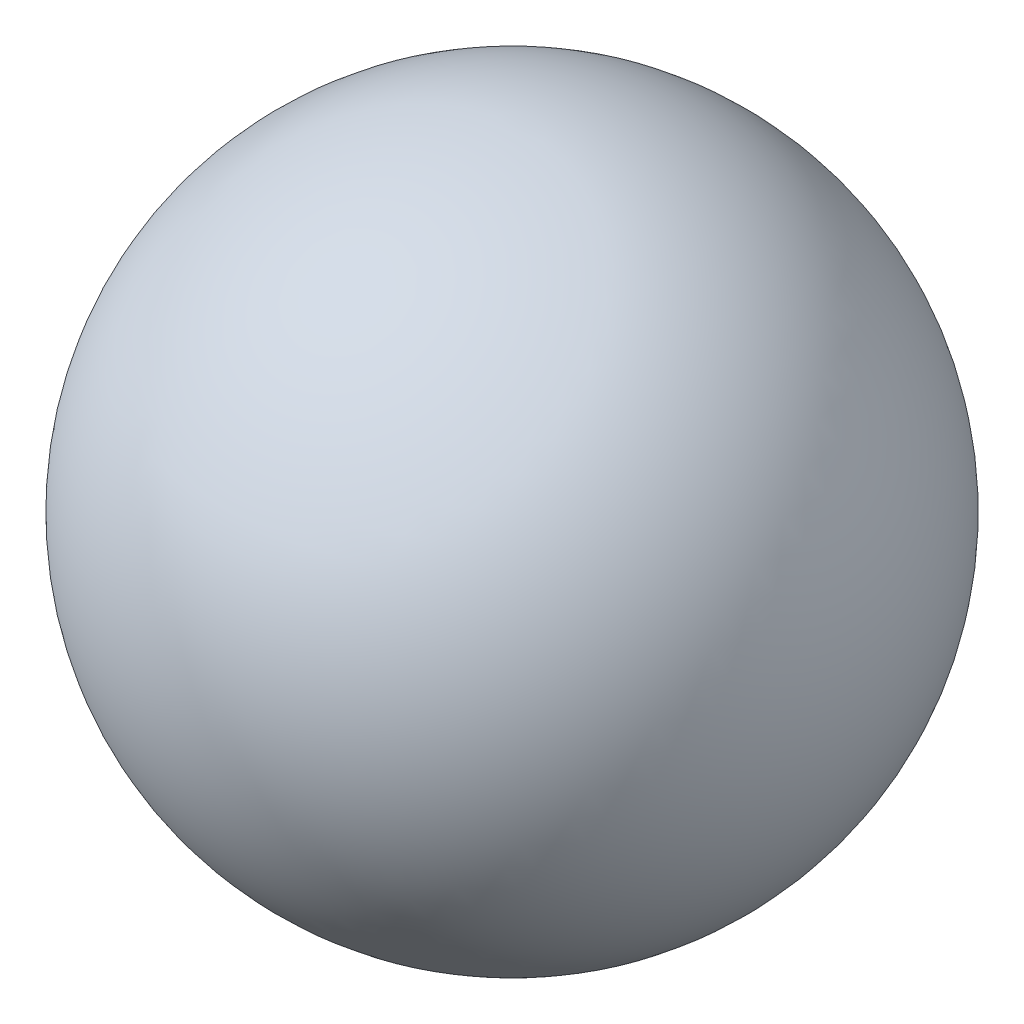
ISO-10303-21;
HEADER;
FILE_DESCRIPTION(('STEP AP214'),'2;1');
FILE_NAME('part.step','',(''),(''),'','','');
FILE_SCHEMA(('AUTOMOTIVE_DESIGN { 1 0 10303 214 1 1 1 1 }'));
ENDSEC;
DATA;
#1=APPLICATION_CONTEXT('core data for automotive mechanical design processes');
#2=APPLICATION_PROTOCOL_DEFINITION('international standard','automotive_design',2000,#1);
#3=PRODUCT_CONTEXT('',#1,'mechanical');
#4=PRODUCT('Part','Part','',(#3));
#5=PRODUCT_RELATED_PRODUCT_CATEGORY('part','',(#4));
#6=PRODUCT_DEFINITION_FORMATION('','',#4);
#7=PRODUCT_DEFINITION_CONTEXT('part definition',#1,'design');
#8=PRODUCT_DEFINITION('design','',#6,#7);
#9=PRODUCT_DEFINITION_SHAPE('','',#8);
#10=(LENGTH_UNIT() NAMED_UNIT(*) SI_UNIT(.MILLI.,.METRE.));
#11=(NAMED_UNIT(*) PLANE_ANGLE_UNIT() SI_UNIT($,.RADIAN.));
#12=(NAMED_UNIT(*) SI_UNIT($,.STERADIAN.) SOLID_ANGLE_UNIT());
#13=UNCERTAINTY_MEASURE_WITH_UNIT(LENGTH_MEASURE(1.E-05),#10,'distance_accuracy_value','');
#14=(GEOMETRIC_REPRESENTATION_CONTEXT(3) GLOBAL_UNCERTAINTY_ASSIGNED_CONTEXT((#13)) GLOBAL_UNIT_ASSIGNED_CONTEXT((#10,
#11,#12)) REPRESENTATION_CONTEXT('',''));
#15=CARTESIAN_POINT('',(0.,0.,0.));
#16=DIRECTION('',(0.,0.,1.));
#17=DIRECTION('',(1.,0.,0.));
#18=AXIS2_PLACEMENT_3D('',#15,#16,#17);
#19=CARTESIAN_POINT('',(0.,0.,0.));
#20=DIRECTION('',(0.,1.,0.));
#21=DIRECTION('',(1.,0.,0.));
#22=AXIS2_PLACEMENT_3D('',#19,#20,#21);
#23=SPHERICAL_SURFACE('',#22,37.);
#24=CARTESIAN_POINT('',(3.8215338860829E-13,37.,0.));
#25=VERTEX_POINT('',#24);
#26=VERTEX_LOOP('',#25);
#27=FACE_BOUND('',#26,.T.);
#28=ADVANCED_FACE('F37',(#27),#23,.T.);
#29=CLOSED_SHELL('',(#28));
#30=CARTESIAN_POINT('',(0.,0.,0.));
#31=DIRECTION('',(0.,1.,0.));
#32=DIRECTION('',(-1.,0.,0.));
#33=AXIS2_PLACEMENT_3D('',#30,#31,#32);
#34=SPHERICAL_SURFACE('',#33,36.);
#35=CARTESIAN_POINT('',(3.71824918645904E-13,36.,0.));
#36=VERTEX_POINT('',#35);
#37=VERTEX_LOOP('',#36);
#38=FACE_BOUND('',#37,.T.);
#39=ADVANCED_FACE('F51',(#38),#34,.F.);
#40=CLOSED_SHELL('',(#39));
#41=ORIENTED_CLOSED_SHELL('',*,#40,.T.);
#42=BREP_WITH_VOIDS('B2',#29,(#41));
#43=ADVANCED_BREP_SHAPE_REPRESENTATION('',(#18,#42),#14);
#44=SHAPE_DEFINITION_REPRESENTATION(#9,#43);
ENDSEC;
END-ISO-10303-21;
